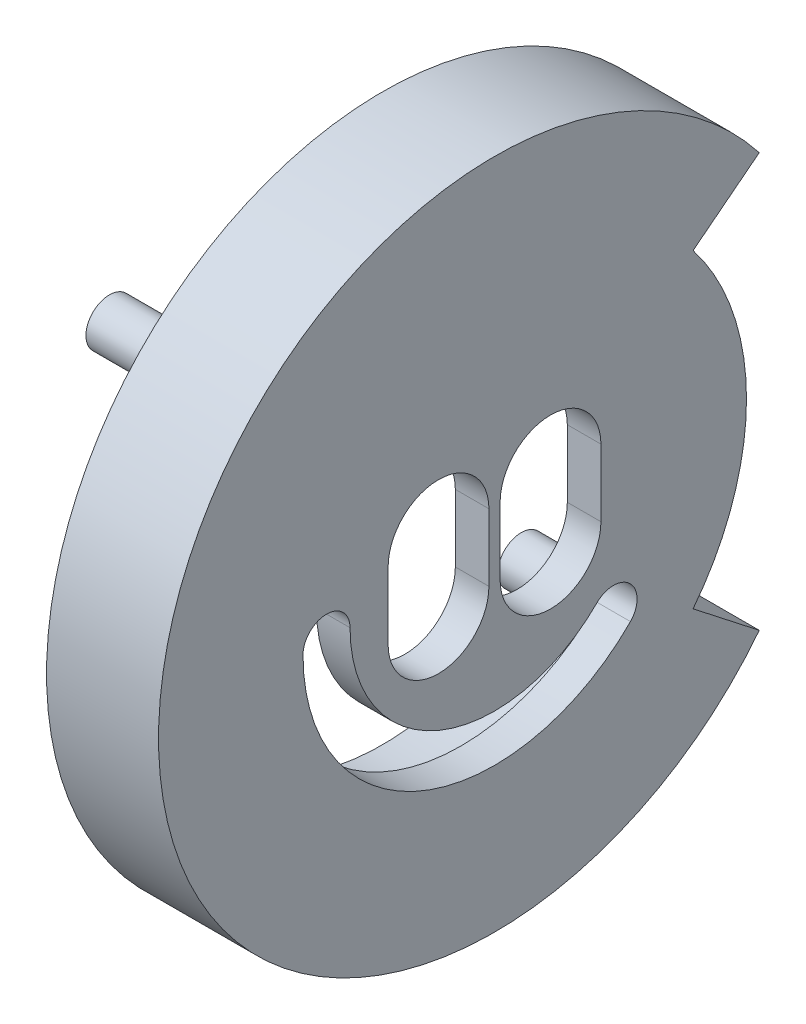
ISO-10303-21;
HEADER;
FILE_DESCRIPTION(('STEP AP214'),'2;1');
FILE_NAME('part.step','',(''),(''),'','','');
FILE_SCHEMA(('AUTOMOTIVE_DESIGN { 1 0 10303 214 1 1 1 1 }'));
ENDSEC;
DATA;
#1=APPLICATION_CONTEXT('core data for automotive mechanical design processes');
#2=APPLICATION_PROTOCOL_DEFINITION('international standard','automotive_design',2000,#1);
#3=PRODUCT_CONTEXT('',#1,'mechanical');
#4=PRODUCT('Part','Part','',(#3));
#5=PRODUCT_RELATED_PRODUCT_CATEGORY('part','',(#4));
#6=PRODUCT_DEFINITION_FORMATION('','',#4);
#7=PRODUCT_DEFINITION_CONTEXT('part definition',#1,'design');
#8=PRODUCT_DEFINITION('design','',#6,#7);
#9=PRODUCT_DEFINITION_SHAPE('','',#8);
#10=(LENGTH_UNIT() NAMED_UNIT(*) SI_UNIT(.MILLI.,.METRE.));
#11=(NAMED_UNIT(*) PLANE_ANGLE_UNIT() SI_UNIT($,.RADIAN.));
#12=(NAMED_UNIT(*) SI_UNIT($,.STERADIAN.) SOLID_ANGLE_UNIT());
#13=UNCERTAINTY_MEASURE_WITH_UNIT(LENGTH_MEASURE(1.E-05),#10,'distance_accuracy_value','');
#14=(GEOMETRIC_REPRESENTATION_CONTEXT(3) GLOBAL_UNCERTAINTY_ASSIGNED_CONTEXT((#13)) GLOBAL_UNIT_ASSIGNED_CONTEXT((#10,
#11,#12)) REPRESENTATION_CONTEXT('',''));
#15=CARTESIAN_POINT('',(0.,0.,0.));
#16=DIRECTION('',(0.,0.,1.));
#17=DIRECTION('',(1.,0.,0.));
#18=AXIS2_PLACEMENT_3D('',#15,#16,#17);
#19=CARTESIAN_POINT('',(0.,0.,0.));
#20=DIRECTION('',(1.,0.,0.));
#21=DIRECTION('',(0.,0.,1.));
#22=AXIS2_PLACEMENT_3D('',#19,#20,#21);
#23=CYLINDRICAL_SURFACE('',#22,30.);
#24=DIRECTION('',(1.,0.,0.));
#25=VECTOR('',#24,1.);
#26=CARTESIAN_POINT('',(0.,-18.4698442597698,-23.6403226082017));
#27=LINE('',#26,#25);
#28=CARTESIAN_POINT('',(-5.,-18.4698442597698,-23.6403226082017));
#29=VERTEX_POINT('',#28);
#30=CARTESIAN_POINT('',(5.,-18.4698442597698,-23.6403226082017));
#31=VERTEX_POINT('',#30);
#32=EDGE_CURVE('E256',#29,#31,#27,.T.);
#33=ORIENTED_EDGE('',*,*,#32,.T.);
#34=CARTESIAN_POINT('',(5.,0.,0.));
#35=DIRECTION('',(1.,0.,0.));
#36=DIRECTION('',(0.,1.,0.));
#37=AXIS2_PLACEMENT_3D('',#34,#35,#36);
#38=CIRCLE('',#37,30.);
#39=CARTESIAN_POINT('',(5.,18.4698442597697,-23.6403226082017));
#40=VERTEX_POINT('',#39);
#41=EDGE_CURVE('E313',#40,#31,#38,.T.);
#42=ORIENTED_EDGE('',*,*,#41,.F.);
#43=DIRECTION('',(-1.,0.,0.));
#44=VECTOR('',#43,1.);
#45=CARTESIAN_POINT('',(0.,18.4698442597697,-23.6403226082017));
#46=LINE('',#45,#44);
#47=CARTESIAN_POINT('',(-5.,18.4698442597697,-23.6403226082017));
#48=VERTEX_POINT('',#47);
#49=EDGE_CURVE('E228',#40,#48,#46,.T.);
#50=ORIENTED_EDGE('',*,*,#49,.T.);
#51=CARTESIAN_POINT('',(-5.,0.,0.));
#52=DIRECTION('',(-1.,0.,0.));
#53=DIRECTION('',(0.,1.,0.));
#54=AXIS2_PLACEMENT_3D('',#51,#52,#53);
#55=CIRCLE('',#54,30.);
#56=EDGE_CURVE('E307',#29,#48,#55,.T.);
#57=ORIENTED_EDGE('',*,*,#56,.F.);
#58=EDGE_LOOP('',(#33,#42,#50,#57));
#59=FACE_BOUND('',#58,.T.);
#60=ADVANCED_FACE('F17',(#59),#23,.T.);
#61=CARTESIAN_POINT('',(0.,0.,0.));
#62=DIRECTION('',(1.,0.,0.));
#63=DIRECTION('',(0.,-1.,0.));
#64=AXIS2_PLACEMENT_3D('',#61,#62,#63);
#65=CYLINDRICAL_SURFACE('',#64,20.5);
#66=CARTESIAN_POINT('',(2.,0.,0.));
#67=DIRECTION('',(1.,0.,0.));
#68=DIRECTION('',(0.,-1.,0.));
#69=AXIS2_PLACEMENT_3D('',#66,#67,#68);
#70=CIRCLE('',#69,20.5);
#71=CARTESIAN_POINT('',(2.,20.5,0.));
#72=VERTEX_POINT('',#71);
#73=EDGE_CURVE('E372',#72,#72,#70,.T.);
#74=ORIENTED_EDGE('',*,*,#73,.T.);
#75=DIRECTION('',(-1.,0.,0.));
#76=VECTOR('',#75,1.);
#77=CARTESIAN_POINT('',(0.,20.5,0.));
#78=LINE('',#77,#76);
#79=CARTESIAN_POINT('',(-5.,20.5,0.));
#80=VERTEX_POINT('',#79);
#81=EDGE_CURVE('E11',#72,#80,#78,.T.);
#82=ORIENTED_EDGE('',*,*,#81,.T.);
#83=CARTESIAN_POINT('',(-5.,0.,0.));
#84=DIRECTION('',(1.,0.,0.));
#85=DIRECTION('',(0.,-1.,0.));
#86=AXIS2_PLACEMENT_3D('',#83,#84,#85);
#87=CIRCLE('',#86,20.5);
#88=EDGE_CURVE('E28',#80,#80,#87,.T.);
#89=ORIENTED_EDGE('',*,*,#88,.F.);
#90=ORIENTED_EDGE('',*,*,#81,.F.);
#91=EDGE_LOOP('',(#74,#82,#89,#90));
#92=FACE_BOUND('',#91,.T.);
#93=ADVANCED_FACE('F475',(#92),#65,.F.);
#94=CARTESIAN_POINT('',(-5.,0.,0.));
#95=DIRECTION('',(1.,0.,0.));
#96=DIRECTION('',(0.,1.,0.));
#97=AXIS2_PLACEMENT_3D('',#94,#95,#96);
#98=PLANE('',#97);
#99=ORIENTED_EDGE('',*,*,#88,.T.);
#100=EDGE_LOOP('',(#99));
#101=FACE_BOUND('',#100,.T.);
#102=CARTESIAN_POINT('',(-5.,-18.3847763108503,18.3847763108502));
#103=DIRECTION('',(1.,0.,0.));
#104=DIRECTION('',(0.,0.,-1.));
#105=AXIS2_PLACEMENT_3D('',#102,#103,#104);
#106=CIRCLE('',#105,2.1);
#107=CARTESIAN_POINT('',(-5.,-18.3847763108503,20.4847763108503));
#108=VERTEX_POINT('',#107);
#109=EDGE_CURVE('E393',#108,#108,#106,.T.);
#110=ORIENTED_EDGE('',*,*,#109,.T.);
#111=EDGE_LOOP('',(#110));
#112=FACE_BOUND('',#111,.T.);
#113=CARTESIAN_POINT('',(-5.,18.3847763108502,18.3847763108503));
#114=DIRECTION('',(1.,0.,0.));
#115=DIRECTION('',(0.,0.,-1.));
#116=AXIS2_PLACEMENT_3D('',#113,#114,#115);
#117=CIRCLE('',#116,2.1);
#118=CARTESIAN_POINT('',(-5.,18.3847763108502,20.4847763108503));
#119=VERTEX_POINT('',#118);
#120=EDGE_CURVE('E21',#119,#119,#117,.T.);
#121=ORIENTED_EDGE('',*,*,#120,.T.);
#122=EDGE_LOOP('',(#121));
#123=FACE_BOUND('',#122,.T.);
#124=CARTESIAN_POINT('',(-5.,-18.3847763108502,-18.3847763108503));
#125=DIRECTION('',(1.,0.,0.));
#126=DIRECTION('',(0.,0.,-1.));
#127=AXIS2_PLACEMENT_3D('',#124,#125,#126);
#128=CIRCLE('',#127,2.1);
#129=CARTESIAN_POINT('',(-5.,-18.3847763108502,-16.2847763108503));
#130=VERTEX_POINT('',#129);
#131=EDGE_CURVE('E300',#130,#130,#128,.T.);
#132=ORIENTED_EDGE('',*,*,#131,.T.);
#133=EDGE_LOOP('',(#132));
#134=FACE_BOUND('',#133,.T.);
#135=CARTESIAN_POINT('',(-5.,18.3847763108503,-18.3847763108503));
#136=DIRECTION('',(1.,0.,0.));
#137=DIRECTION('',(0.,0.,-1.));
#138=AXIS2_PLACEMENT_3D('',#135,#136,#137);
#139=CIRCLE('',#138,2.1);
#140=CARTESIAN_POINT('',(-5.,18.3847763108503,-16.2847763108503));
#141=VERTEX_POINT('',#140);
#142=EDGE_CURVE('E295',#141,#141,#139,.T.);
#143=ORIENTED_EDGE('',*,*,#142,.T.);
#144=EDGE_LOOP('',(#143));
#145=FACE_BOUND('',#144,.T.);
#146=DIRECTION('',(0.,-0.615661475325658,-0.788010753606722));
#147=VECTOR('',#146,1.);
#148=CARTESIAN_POINT('',(-5.,-9.29598589079823,-11.8983193539121));
#149=LINE('',#148,#147);
#150=CARTESIAN_POINT('',(-5.,-13.8523831948273,-17.7302419561512));
#151=VERTEX_POINT('',#150);
#152=EDGE_CURVE('E260',#151,#29,#149,.T.);
#153=ORIENTED_EDGE('',*,*,#152,.T.);
#154=ORIENTED_EDGE('',*,*,#56,.T.);
#155=DIRECTION('',(0.,-0.615661475325658,0.788010753606722));
#156=VECTOR('',#155,1.);
#157=CARTESIAN_POINT('',(-5.,6.92619159741366,-8.86512097807562));
#158=LINE('',#157,#156);
#159=CARTESIAN_POINT('',(-5.,13.8523831948273,-17.7302419561512));
#160=VERTEX_POINT('',#159);
#161=EDGE_CURVE('E214',#48,#160,#158,.T.);
#162=ORIENTED_EDGE('',*,*,#161,.T.);
#163=CARTESIAN_POINT('',(-5.,0.,0.));
#164=DIRECTION('',(-1.,0.,0.));
#165=DIRECTION('',(0.,0.,1.));
#166=AXIS2_PLACEMENT_3D('',#163,#164,#165);
#167=CIRCLE('',#166,22.5);
#168=EDGE_CURVE('E220',#160,#151,#167,.T.);
#169=ORIENTED_EDGE('',*,*,#168,.T.);
#170=EDGE_LOOP('',(#153,#154,#162,#169));
#171=FACE_BOUND('',#170,.T.);
#172=ADVANCED_FACE('F481',(#101,#112,#123,#134,#145,#171),#98,.F.);
#173=CARTESIAN_POINT('',(2.,0.,0.));
#174=DIRECTION('',(-1.,0.,0.));
#175=DIRECTION('',(0.,0.,1.));
#176=AXIS2_PLACEMENT_3D('',#173,#174,#175);
#177=PLANE('',#176);
#178=CARTESIAN_POINT('',(2.,-3.,-5.));
#179=DIRECTION('',(1.,0.,0.));
#180=DIRECTION('',(0.,0.,-1.));
#181=AXIS2_PLACEMENT_3D('',#178,#179,#180);
#182=CIRCLE('',#181,4.5);
#183=CARTESIAN_POINT('',(2.,-3.,-0.5));
#184=VERTEX_POINT('',#183);
#185=CARTESIAN_POINT('',(2.,-3.,-9.5));
#186=VERTEX_POINT('',#185);
#187=EDGE_CURVE('E390',#184,#186,#182,.T.);
#188=ORIENTED_EDGE('',*,*,#187,.T.);
#189=DIRECTION('',(0.,1.,0.));
#190=VECTOR('',#189,1.);
#191=CARTESIAN_POINT('',(2.,3.,-9.5));
#192=LINE('',#191,#190);
#193=CARTESIAN_POINT('',(2.,3.,-9.5));
#194=VERTEX_POINT('',#193);
#195=EDGE_CURVE('E254',#186,#194,#192,.T.);
#196=ORIENTED_EDGE('',*,*,#195,.T.);
#197=CARTESIAN_POINT('',(2.,3.,-5.));
#198=DIRECTION('',(1.,0.,0.));
#199=DIRECTION('',(0.,0.,1.));
#200=AXIS2_PLACEMENT_3D('',#197,#198,#199);
#201=CIRCLE('',#200,4.5);
#202=CARTESIAN_POINT('',(2.,3.,-0.5));
#203=VERTEX_POINT('',#202);
#204=EDGE_CURVE('E255',#194,#203,#201,.T.);
#205=ORIENTED_EDGE('',*,*,#204,.T.);
#206=DIRECTION('',(0.,-1.,0.));
#207=VECTOR('',#206,1.);
#208=CARTESIAN_POINT('',(2.,-25.,-0.5));
#209=LINE('',#208,#207);
#210=EDGE_CURVE('E369',#203,#184,#209,.T.);
#211=ORIENTED_EDGE('',*,*,#210,.T.);
#212=EDGE_LOOP('',(#188,#196,#205,#211));
#213=FACE_BOUND('',#212,.T.);
#214=DIRECTION('',(0.,1.,0.));
#215=VECTOR('',#214,1.);
#216=CARTESIAN_POINT('',(2.,25.,0.499999999999983));
#217=LINE('',#216,#215);
#218=CARTESIAN_POINT('',(2.,-3.,0.5));
#219=VERTEX_POINT('',#218);
#220=CARTESIAN_POINT('',(2.,3.,0.5));
#221=VERTEX_POINT('',#220);
#222=EDGE_CURVE('E274',#219,#221,#217,.T.);
#223=ORIENTED_EDGE('',*,*,#222,.T.);
#224=CARTESIAN_POINT('',(2.,3.,5.));
#225=DIRECTION('',(1.,0.,0.));
#226=DIRECTION('',(0.,0.,1.));
#227=AXIS2_PLACEMENT_3D('',#224,#225,#226);
#228=CIRCLE('',#227,4.5);
#229=CARTESIAN_POINT('',(2.,3.,9.5));
#230=VERTEX_POINT('',#229);
#231=EDGE_CURVE('E261',#221,#230,#228,.T.);
#232=ORIENTED_EDGE('',*,*,#231,.T.);
#233=DIRECTION('',(0.,-1.,0.));
#234=VECTOR('',#233,1.);
#235=CARTESIAN_POINT('',(2.,-3.,9.5));
#236=LINE('',#235,#234);
#237=CARTESIAN_POINT('',(2.,-3.,9.5));
#238=VERTEX_POINT('',#237);
#239=EDGE_CURVE('E287',#230,#238,#236,.T.);
#240=ORIENTED_EDGE('',*,*,#239,.T.);
#241=CARTESIAN_POINT('',(2.,-3.,5.));
#242=DIRECTION('',(1.,0.,0.));
#243=DIRECTION('',(0.,0.,-1.));
#244=AXIS2_PLACEMENT_3D('',#241,#242,#243);
#245=CIRCLE('',#244,4.5);
#246=EDGE_CURVE('E346',#238,#219,#245,.T.);
#247=ORIENTED_EDGE('',*,*,#246,.T.);
#248=EDGE_LOOP('',(#223,#232,#240,#247));
#249=FACE_BOUND('',#248,.T.);
#250=CARTESIAN_POINT('',(2.,0.,15.));
#251=DIRECTION('',(1.,0.,0.));
#252=DIRECTION('',(0.,0.,-1.));
#253=AXIS2_PLACEMENT_3D('',#250,#251,#252);
#254=CIRCLE('',#253,2.1);
#255=CARTESIAN_POINT('',(2.,0.,12.9));
#256=VERTEX_POINT('',#255);
#257=CARTESIAN_POINT('',(2.,0.,17.1));
#258=VERTEX_POINT('',#257);
#259=EDGE_CURVE('E238',#256,#258,#254,.T.);
#260=ORIENTED_EDGE('',*,*,#259,.T.);
#261=CARTESIAN_POINT('',(2.,0.,0.));
#262=DIRECTION('',(1.,0.,0.));
#263=DIRECTION('',(0.,0.,-1.));
#264=AXIS2_PLACEMENT_3D('',#261,#262,#263);
#265=CIRCLE('',#264,17.1);
#266=CARTESIAN_POINT('',(2.,-12.0444371219939,-12.1384321233978));
#267=VERTEX_POINT('',#266);
#268=EDGE_CURVE('E280',#258,#267,#265,.T.);
#269=ORIENTED_EDGE('',*,*,#268,.T.);
#270=CARTESIAN_POINT('',(2.,-10.5859887010411,-10.6272147345554));
#271=DIRECTION('',(1.,0.,0.));
#272=DIRECTION('',(0.,-0.71685343909435,-0.697223885748762));
#273=AXIS2_PLACEMENT_3D('',#270,#271,#272);
#274=CIRCLE('',#273,2.10020232190131);
#275=CARTESIAN_POINT('',(2.,-9.08615432009881,-9.1570628299335));
#276=VERTEX_POINT('',#275);
#277=EDGE_CURVE('E279',#267,#276,#274,.T.);
#278=ORIENTED_EDGE('',*,*,#277,.T.);
#279=CARTESIAN_POINT('',(2.,0.,0.));
#280=DIRECTION('',(-1.,0.,0.));
#281=DIRECTION('',(0.,0.,1.));
#282=AXIS2_PLACEMENT_3D('',#279,#280,#281);
#283=CIRCLE('',#282,12.9);
#284=EDGE_CURVE('E248',#276,#256,#283,.T.);
#285=ORIENTED_EDGE('',*,*,#284,.T.);
#286=EDGE_LOOP('',(#260,#269,#278,#285));
#287=FACE_BOUND('',#286,.T.);
#288=ORIENTED_EDGE('',*,*,#73,.F.);
#289=EDGE_LOOP('',(#288));
#290=FACE_BOUND('',#289,.T.);
#291=ADVANCED_FACE('F447',(#213,#249,#287,#290),#177,.T.);
#292=CARTESIAN_POINT('',(5.,25.,-0.500000000000011));
#293=DIRECTION('',(0.,0.,-1.));
#294=DIRECTION('',(0.,-1.,0.));
#295=AXIS2_PLACEMENT_3D('',#292,#293,#294);
#296=PLANE('',#295);
#297=DIRECTION('',(1.,0.,0.));
#298=VECTOR('',#297,1.);
#299=CARTESIAN_POINT('',(5.,-3.,-0.500000000000007));
#300=LINE('',#299,#298);
#301=CARTESIAN_POINT('',(5.,-3.,-0.5));
#302=VERTEX_POINT('',#301);
#303=EDGE_CURVE('E388',#184,#302,#300,.T.);
#304=ORIENTED_EDGE('',*,*,#303,.F.);
#305=ORIENTED_EDGE('',*,*,#210,.F.);
#306=DIRECTION('',(1.,0.,0.));
#307=VECTOR('',#306,1.);
#308=CARTESIAN_POINT('',(5.,3.,-0.500000000000008));
#309=LINE('',#308,#307);
#310=CARTESIAN_POINT('',(5.,3.,-0.5));
#311=VERTEX_POINT('',#310);
#312=EDGE_CURVE('E387',#203,#311,#309,.T.);
#313=ORIENTED_EDGE('',*,*,#312,.T.);
#314=DIRECTION('',(0.,1.,0.));
#315=VECTOR('',#314,1.);
#316=CARTESIAN_POINT('',(5.,-25.,-0.5));
#317=LINE('',#316,#315);
#318=EDGE_CURVE('E308',#302,#311,#317,.T.);
#319=ORIENTED_EDGE('',*,*,#318,.F.);
#320=EDGE_LOOP('',(#304,#305,#313,#319));
#321=FACE_BOUND('',#320,.T.);
#322=ADVANCED_FACE('F453',(#321),#296,.T.);
#323=CARTESIAN_POINT('',(5.,-25.,0.5));
#324=DIRECTION('',(0.,0.,1.));
#325=DIRECTION('',(0.,-1.,0.));
#326=AXIS2_PLACEMENT_3D('',#323,#324,#325);
#327=PLANE('',#326);
#328=DIRECTION('',(1.,0.,0.));
#329=VECTOR('',#328,1.);
#330=CARTESIAN_POINT('',(5.,-3.,0.49999999999999));
#331=LINE('',#330,#329);
#332=CARTESIAN_POINT('',(5.,-3.,0.5));
#333=VERTEX_POINT('',#332);
#334=EDGE_CURVE('E365',#219,#333,#331,.T.);
#335=ORIENTED_EDGE('',*,*,#334,.T.);
#336=DIRECTION('',(0.,-1.,0.));
#337=VECTOR('',#336,1.);
#338=CARTESIAN_POINT('',(5.,25.,0.499999999999983));
#339=LINE('',#338,#337);
#340=CARTESIAN_POINT('',(5.,3.,0.5));
#341=VERTEX_POINT('',#340);
#342=EDGE_CURVE('E314',#341,#333,#339,.T.);
#343=ORIENTED_EDGE('',*,*,#342,.F.);
#344=DIRECTION('',(1.,0.,0.));
#345=VECTOR('',#344,1.);
#346=CARTESIAN_POINT('',(5.,3.,0.499999999999989));
#347=LINE('',#346,#345);
#348=EDGE_CURVE('E264',#221,#341,#347,.T.);
#349=ORIENTED_EDGE('',*,*,#348,.F.);
#350=ORIENTED_EDGE('',*,*,#222,.F.);
#351=EDGE_LOOP('',(#335,#343,#349,#350));
#352=FACE_BOUND('',#351,.T.);
#353=ADVANCED_FACE('F504',(#352),#327,.T.);
#354=CARTESIAN_POINT('',(5.,3.,5.));
#355=DIRECTION('',(-1.,0.,0.));
#356=DIRECTION('',(0.,0.,1.));
#357=AXIS2_PLACEMENT_3D('',#354,#355,#356);
#358=CYLINDRICAL_SURFACE('',#357,4.5);
#359=CARTESIAN_POINT('',(5.,3.,5.));
#360=DIRECTION('',(-1.,0.,0.));
#361=DIRECTION('',(0.,0.,1.));
#362=AXIS2_PLACEMENT_3D('',#359,#360,#361);
#363=CIRCLE('',#362,4.5);
#364=CARTESIAN_POINT('',(5.,3.,9.5));
#365=VERTEX_POINT('',#364);
#366=EDGE_CURVE('E318',#365,#341,#363,.T.);
#367=ORIENTED_EDGE('',*,*,#366,.F.);
#368=DIRECTION('',(-1.,0.,0.));
#369=VECTOR('',#368,1.);
#370=CARTESIAN_POINT('',(5.,3.,9.5));
#371=LINE('',#370,#369);
#372=EDGE_CURVE('E265',#365,#230,#371,.T.);
#373=ORIENTED_EDGE('',*,*,#372,.T.);
#374=ORIENTED_EDGE('',*,*,#231,.F.);
#375=ORIENTED_EDGE('',*,*,#348,.T.);
#376=EDGE_LOOP('',(#367,#373,#374,#375));
#377=FACE_BOUND('',#376,.T.);
#378=ADVANCED_FACE('F507',(#377),#358,.F.);
#379=CARTESIAN_POINT('',(5.,3.,9.5));
#380=DIRECTION('',(0.,0.,-1.));
#381=DIRECTION('',(0.,-1.,0.));
#382=AXIS2_PLACEMENT_3D('',#379,#380,#381);
#383=PLANE('',#382);
#384=DIRECTION('',(0.,1.,0.));
#385=VECTOR('',#384,1.);
#386=CARTESIAN_POINT('',(5.,-3.,9.5));
#387=LINE('',#386,#385);
#388=CARTESIAN_POINT('',(5.,-3.,9.5));
#389=VERTEX_POINT('',#388);
#390=EDGE_CURVE('E352',#389,#365,#387,.T.);
#391=ORIENTED_EDGE('',*,*,#390,.F.);
#392=DIRECTION('',(-1.,0.,0.));
#393=VECTOR('',#392,1.);
#394=CARTESIAN_POINT('',(5.,-3.,9.5));
#395=LINE('',#394,#393);
#396=EDGE_CURVE('E304',#389,#238,#395,.T.);
#397=ORIENTED_EDGE('',*,*,#396,.T.);
#398=ORIENTED_EDGE('',*,*,#239,.F.);
#399=ORIENTED_EDGE('',*,*,#372,.F.);
#400=EDGE_LOOP('',(#391,#397,#398,#399));
#401=FACE_BOUND('',#400,.T.);
#402=ADVANCED_FACE('F514',(#401),#383,.T.);
#403=CARTESIAN_POINT('',(5.,-3.,5.));
#404=DIRECTION('',(-1.,0.,0.));
#405=DIRECTION('',(0.,0.,-1.));
#406=AXIS2_PLACEMENT_3D('',#403,#404,#405);
#407=CYLINDRICAL_SURFACE('',#406,4.5);
#408=CARTESIAN_POINT('',(5.,-3.,5.));
#409=DIRECTION('',(-1.,0.,0.));
#410=DIRECTION('',(0.,0.,-1.));
#411=AXIS2_PLACEMENT_3D('',#408,#409,#410);
#412=CIRCLE('',#411,4.5);
#413=EDGE_CURVE('E348',#333,#389,#412,.T.);
#414=ORIENTED_EDGE('',*,*,#413,.F.);
#415=ORIENTED_EDGE('',*,*,#334,.F.);
#416=ORIENTED_EDGE('',*,*,#246,.F.);
#417=ORIENTED_EDGE('',*,*,#396,.F.);
#418=EDGE_LOOP('',(#414,#415,#416,#417));
#419=FACE_BOUND('',#418,.T.);
#420=ADVANCED_FACE('F511',(#419),#407,.F.);
#421=CARTESIAN_POINT('',(5.,-3.,-5.));
#422=DIRECTION('',(-1.,0.,0.));
#423=DIRECTION('',(0.,0.,-1.));
#424=AXIS2_PLACEMENT_3D('',#421,#422,#423);
#425=CYLINDRICAL_SURFACE('',#424,4.5);
#426=CARTESIAN_POINT('',(5.,-3.,-5.));
#427=DIRECTION('',(-1.,0.,0.));
#428=DIRECTION('',(0.,0.,-1.));
#429=AXIS2_PLACEMENT_3D('',#426,#427,#428);
#430=CIRCLE('',#429,4.5);
#431=CARTESIAN_POINT('',(5.,-3.,-9.5));
#432=VERTEX_POINT('',#431);
#433=EDGE_CURVE('E353',#432,#302,#430,.T.);
#434=ORIENTED_EDGE('',*,*,#433,.F.);
#435=DIRECTION('',(-1.,0.,0.));
#436=VECTOR('',#435,1.);
#437=CARTESIAN_POINT('',(5.,-3.,-9.5));
#438=LINE('',#437,#436);
#439=EDGE_CURVE('E356',#432,#186,#438,.T.);
#440=ORIENTED_EDGE('',*,*,#439,.T.);
#441=ORIENTED_EDGE('',*,*,#187,.F.);
#442=ORIENTED_EDGE('',*,*,#303,.T.);
#443=EDGE_LOOP('',(#434,#440,#441,#442));
#444=FACE_BOUND('',#443,.T.);
#445=ADVANCED_FACE('F440',(#444),#425,.F.);
#446=CARTESIAN_POINT('',(5.,-3.,-9.5));
#447=DIRECTION('',(0.,0.,1.));
#448=DIRECTION('',(1.,0.,0.));
#449=AXIS2_PLACEMENT_3D('',#446,#447,#448);
#450=PLANE('',#449);
#451=DIRECTION('',(0.,-1.,0.));
#452=VECTOR('',#451,1.);
#453=CARTESIAN_POINT('',(5.,3.,-9.5));
#454=LINE('',#453,#452);
#455=CARTESIAN_POINT('',(5.,3.,-9.5));
#456=VERTEX_POINT('',#455);
#457=EDGE_CURVE('E343',#456,#432,#454,.T.);
#458=ORIENTED_EDGE('',*,*,#457,.F.);
#459=DIRECTION('',(-1.,0.,0.));
#460=VECTOR('',#459,1.);
#461=CARTESIAN_POINT('',(5.,3.,-9.5));
#462=LINE('',#461,#460);
#463=EDGE_CURVE('E250',#456,#194,#462,.T.);
#464=ORIENTED_EDGE('',*,*,#463,.T.);
#465=ORIENTED_EDGE('',*,*,#195,.F.);
#466=ORIENTED_EDGE('',*,*,#439,.F.);
#467=EDGE_LOOP('',(#458,#464,#465,#466));
#468=FACE_BOUND('',#467,.T.);
#469=ADVANCED_FACE('F444',(#468),#450,.T.);
#470=CARTESIAN_POINT('',(5.,3.,-5.));
#471=DIRECTION('',(-1.,0.,0.));
#472=DIRECTION('',(0.,0.,1.));
#473=AXIS2_PLACEMENT_3D('',#470,#471,#472);
#474=CYLINDRICAL_SURFACE('',#473,4.5);
#475=CARTESIAN_POINT('',(5.,3.,-5.));
#476=DIRECTION('',(-1.,0.,0.));
#477=DIRECTION('',(0.,0.,1.));
#478=AXIS2_PLACEMENT_3D('',#475,#476,#477);
#479=CIRCLE('',#478,4.5);
#480=EDGE_CURVE('E312',#311,#456,#479,.T.);
#481=ORIENTED_EDGE('',*,*,#480,.F.);
#482=ORIENTED_EDGE('',*,*,#312,.F.);
#483=ORIENTED_EDGE('',*,*,#204,.F.);
#484=ORIENTED_EDGE('',*,*,#463,.F.);
#485=EDGE_LOOP('',(#481,#482,#483,#484));
#486=FACE_BOUND('',#485,.T.);
#487=ADVANCED_FACE('F461',(#486),#474,.F.);
#488=CARTESIAN_POINT('',(-11.,-18.3847763108503,18.3847763108503));
#489=DIRECTION('',(1.,0.,0.));
#490=DIRECTION('',(0.,1.,0.));
#491=AXIS2_PLACEMENT_3D('',#488,#489,#490);
#492=PLANE('',#491);
#493=CARTESIAN_POINT('',(-11.,-18.3847763108503,18.3847763108502));
#494=DIRECTION('',(-1.,0.,0.));
#495=DIRECTION('',(0.,0.,-1.));
#496=AXIS2_PLACEMENT_3D('',#493,#494,#495);
#497=CIRCLE('',#496,2.1);
#498=CARTESIAN_POINT('',(-11.,-18.3847763108503,20.4847763108503));
#499=VERTEX_POINT('',#498);
#500=EDGE_CURVE('E357',#499,#499,#497,.T.);
#501=ORIENTED_EDGE('',*,*,#500,.T.);
#502=EDGE_LOOP('',(#501));
#503=FACE_BOUND('',#502,.T.);
#504=ADVANCED_FACE('F19',(#503),#492,.F.);
#505=CARTESIAN_POINT('',(5.,-18.3847763108503,18.3847763108502));
#506=DIRECTION('',(-1.,0.,0.));
#507=DIRECTION('',(0.,0.,-1.));
#508=AXIS2_PLACEMENT_3D('',#505,#506,#507);
#509=CYLINDRICAL_SURFACE('',#508,2.1);
#510=ORIENTED_EDGE('',*,*,#500,.F.);
#511=DIRECTION('',(1.,0.,0.));
#512=VECTOR('',#511,1.);
#513=CARTESIAN_POINT('',(5.,-18.3847763108503,20.4847763108503));
#514=LINE('',#513,#512);
#515=EDGE_CURVE('E361',#499,#108,#514,.T.);
#516=ORIENTED_EDGE('',*,*,#515,.T.);
#517=ORIENTED_EDGE('',*,*,#109,.F.);
#518=ORIENTED_EDGE('',*,*,#515,.F.);
#519=EDGE_LOOP('',(#510,#516,#517,#518));
#520=FACE_BOUND('',#519,.T.);
#521=ADVANCED_FACE('F469',(#520),#509,.T.);
#522=CARTESIAN_POINT('',(-11.,18.3847763108502,18.3847763108503));
#523=DIRECTION('',(1.,0.,0.));
#524=DIRECTION('',(0.,1.,0.));
#525=AXIS2_PLACEMENT_3D('',#522,#523,#524);
#526=PLANE('',#525);
#527=CARTESIAN_POINT('',(-11.,18.3847763108502,18.3847763108503));
#528=DIRECTION('',(-1.,0.,0.));
#529=DIRECTION('',(0.,0.,-1.));
#530=AXIS2_PLACEMENT_3D('',#527,#528,#529);
#531=CIRCLE('',#530,2.1);
#532=CARTESIAN_POINT('',(-11.,18.3847763108502,20.4847763108503));
#533=VERTEX_POINT('',#532);
#534=EDGE_CURVE('E319',#533,#533,#531,.T.);
#535=ORIENTED_EDGE('',*,*,#534,.T.);
#536=EDGE_LOOP('',(#535));
#537=FACE_BOUND('',#536,.T.);
#538=ADVANCED_FACE('F489',(#537),#526,.F.);
#539=CARTESIAN_POINT('',(5.,18.3847763108502,18.3847763108503));
#540=DIRECTION('',(-1.,0.,0.));
#541=DIRECTION('',(0.,0.,-1.));
#542=AXIS2_PLACEMENT_3D('',#539,#540,#541);
#543=CYLINDRICAL_SURFACE('',#542,2.1);
#544=ORIENTED_EDGE('',*,*,#534,.F.);
#545=DIRECTION('',(1.,0.,0.));
#546=VECTOR('',#545,1.);
#547=CARTESIAN_POINT('',(5.,18.3847763108502,20.4847763108503));
#548=LINE('',#547,#546);
#549=EDGE_CURVE('E322',#533,#119,#548,.T.);
#550=ORIENTED_EDGE('',*,*,#549,.T.);
#551=ORIENTED_EDGE('',*,*,#120,.F.);
#552=ORIENTED_EDGE('',*,*,#549,.F.);
#553=EDGE_LOOP('',(#544,#550,#551,#552));
#554=FACE_BOUND('',#553,.T.);
#555=ADVANCED_FACE('F485',(#554),#543,.T.);
#556=CARTESIAN_POINT('',(-11.,-18.3847763108503,-18.3847763108503));
#557=DIRECTION('',(1.,0.,0.));
#558=DIRECTION('',(0.,1.,0.));
#559=AXIS2_PLACEMENT_3D('',#556,#557,#558);
#560=PLANE('',#559);
#561=CARTESIAN_POINT('',(-11.,-18.3847763108502,-18.3847763108503));
#562=DIRECTION('',(-1.,0.,0.));
#563=DIRECTION('',(0.,0.,-1.));
#564=AXIS2_PLACEMENT_3D('',#561,#562,#563);
#565=CIRCLE('',#564,2.1);
#566=CARTESIAN_POINT('',(-11.,-18.3847763108502,-16.2847763108503));
#567=VERTEX_POINT('',#566);
#568=EDGE_CURVE('E301',#567,#567,#565,.T.);
#569=ORIENTED_EDGE('',*,*,#568,.T.);
#570=EDGE_LOOP('',(#569));
#571=FACE_BOUND('',#570,.T.);
#572=ADVANCED_FACE('F488',(#571),#560,.F.);
#573=CARTESIAN_POINT('',(5.,-18.3847763108502,-18.3847763108503));
#574=DIRECTION('',(-1.,0.,0.));
#575=DIRECTION('',(0.,0.,-1.));
#576=AXIS2_PLACEMENT_3D('',#573,#574,#575);
#577=CYLINDRICAL_SURFACE('',#576,2.1);
#578=ORIENTED_EDGE('',*,*,#568,.F.);
#579=DIRECTION('',(1.,0.,0.));
#580=VECTOR('',#579,1.);
#581=CARTESIAN_POINT('',(5.,-18.3847763108502,-16.2847763108503));
#582=LINE('',#581,#580);
#583=EDGE_CURVE('E296',#567,#130,#582,.T.);
#584=ORIENTED_EDGE('',*,*,#583,.T.);
#585=ORIENTED_EDGE('',*,*,#131,.F.);
#586=ORIENTED_EDGE('',*,*,#583,.F.);
#587=EDGE_LOOP('',(#578,#584,#585,#586));
#588=FACE_BOUND('',#587,.T.);
#589=ADVANCED_FACE('F522',(#588),#577,.T.);
#590=CARTESIAN_POINT('',(-11.,18.3847763108503,-18.3847763108503));
#591=DIRECTION('',(1.,0.,0.));
#592=DIRECTION('',(0.,1.,0.));
#593=AXIS2_PLACEMENT_3D('',#590,#591,#592);
#594=PLANE('',#593);
#595=CARTESIAN_POINT('',(-11.,18.3847763108503,-18.3847763108503));
#596=DIRECTION('',(-1.,0.,0.));
#597=DIRECTION('',(0.,0.,-1.));
#598=AXIS2_PLACEMENT_3D('',#595,#596,#597);
#599=CIRCLE('',#598,2.1);
#600=CARTESIAN_POINT('',(-11.,18.3847763108503,-16.2847763108503));
#601=VERTEX_POINT('',#600);
#602=EDGE_CURVE('E283',#601,#601,#599,.T.);
#603=ORIENTED_EDGE('',*,*,#602,.T.);
#604=EDGE_LOOP('',(#603));
#605=FACE_BOUND('',#604,.T.);
#606=ADVANCED_FACE('F519',(#605),#594,.F.);
#607=CARTESIAN_POINT('',(5.,18.3847763108503,-18.3847763108503));
#608=DIRECTION('',(-1.,0.,0.));
#609=DIRECTION('',(0.,0.,-1.));
#610=AXIS2_PLACEMENT_3D('',#607,#608,#609);
#611=CYLINDRICAL_SURFACE('',#610,2.1);
#612=ORIENTED_EDGE('',*,*,#602,.F.);
#613=DIRECTION('',(1.,0.,0.));
#614=VECTOR('',#613,1.);
#615=CARTESIAN_POINT('',(5.,18.3847763108503,-16.2847763108503));
#616=LINE('',#615,#614);
#617=EDGE_CURVE('E291',#601,#141,#616,.T.);
#618=ORIENTED_EDGE('',*,*,#617,.T.);
#619=ORIENTED_EDGE('',*,*,#142,.F.);
#620=ORIENTED_EDGE('',*,*,#617,.F.);
#621=EDGE_LOOP('',(#612,#618,#619,#620));
#622=FACE_BOUND('',#621,.T.);
#623=ADVANCED_FACE('F521',(#622),#611,.T.);
#624=CARTESIAN_POINT('',(5.,0.,0.));
#625=DIRECTION('',(-1.,0.,0.));
#626=DIRECTION('',(0.,0.,-1.));
#627=AXIS2_PLACEMENT_3D('',#624,#625,#626);
#628=CYLINDRICAL_SURFACE('',#627,17.1);
#629=ORIENTED_EDGE('',*,*,#268,.F.);
#630=DIRECTION('',(-1.,0.,0.));
#631=VECTOR('',#630,1.);
#632=CARTESIAN_POINT('',(5.,0.,17.1));
#633=LINE('',#632,#631);
#634=CARTESIAN_POINT('',(5.,0.,17.1));
#635=VERTEX_POINT('',#634);
#636=EDGE_CURVE('E242',#635,#258,#633,.T.);
#637=ORIENTED_EDGE('',*,*,#636,.F.);
#638=CARTESIAN_POINT('',(5.,0.,0.));
#639=DIRECTION('',(-1.,0.,0.));
#640=DIRECTION('',(0.,0.,-1.));
#641=AXIS2_PLACEMENT_3D('',#638,#639,#640);
#642=CIRCLE('',#641,17.1);
#643=CARTESIAN_POINT('',(5.,-12.0444371219939,-12.1384321233978));
#644=VERTEX_POINT('',#643);
#645=EDGE_CURVE('E270',#644,#635,#642,.T.);
#646=ORIENTED_EDGE('',*,*,#645,.F.);
#647=DIRECTION('',(-1.,0.,0.));
#648=VECTOR('',#647,1.);
#649=CARTESIAN_POINT('',(5.,-12.0444371219939,-12.1384321233978));
#650=LINE('',#649,#648);
#651=EDGE_CURVE('E249',#644,#267,#650,.T.);
#652=ORIENTED_EDGE('',*,*,#651,.T.);
#653=EDGE_LOOP('',(#629,#637,#646,#652));
#654=FACE_BOUND('',#653,.T.);
#655=ADVANCED_FACE('F495',(#654),#628,.F.);
#656=CARTESIAN_POINT('',(5.,0.,15.));
#657=DIRECTION('',(-1.,0.,0.));
#658=DIRECTION('',(0.,0.,-1.));
#659=AXIS2_PLACEMENT_3D('',#656,#657,#658);
#660=CYLINDRICAL_SURFACE('',#659,2.1);
#661=ORIENTED_EDGE('',*,*,#259,.F.);
#662=DIRECTION('',(-1.,0.,0.));
#663=VECTOR('',#662,1.);
#664=CARTESIAN_POINT('',(5.,0.,12.9));
#665=LINE('',#664,#663);
#666=CARTESIAN_POINT('',(5.,0.,12.9));
#667=VERTEX_POINT('',#666);
#668=EDGE_CURVE('E243',#667,#256,#665,.T.);
#669=ORIENTED_EDGE('',*,*,#668,.F.);
#670=CARTESIAN_POINT('',(5.,0.,15.));
#671=DIRECTION('',(-1.,0.,0.));
#672=DIRECTION('',(0.,0.,-1.));
#673=AXIS2_PLACEMENT_3D('',#670,#671,#672);
#674=CIRCLE('',#673,2.1);
#675=EDGE_CURVE('E317',#635,#667,#674,.T.);
#676=ORIENTED_EDGE('',*,*,#675,.F.);
#677=ORIENTED_EDGE('',*,*,#636,.T.);
#678=EDGE_LOOP('',(#661,#669,#676,#677));
#679=FACE_BOUND('',#678,.T.);
#680=ADVANCED_FACE('F491',(#679),#660,.F.);
#681=CARTESIAN_POINT('',(5.,0.,0.));
#682=DIRECTION('',(-1.,0.,0.));
#683=DIRECTION('',(0.,0.,1.));
#684=AXIS2_PLACEMENT_3D('',#681,#682,#683);
#685=CYLINDRICAL_SURFACE('',#684,12.9);
#686=ORIENTED_EDGE('',*,*,#284,.F.);
#687=DIRECTION('',(-1.,0.,0.));
#688=VECTOR('',#687,1.);
#689=CARTESIAN_POINT('',(5.,-9.08615432009881,-9.1570628299335));
#690=LINE('',#689,#688);
#691=CARTESIAN_POINT('',(5.,-9.08615432009881,-9.1570628299335));
#692=VERTEX_POINT('',#691);
#693=EDGE_CURVE('E244',#692,#276,#690,.T.);
#694=ORIENTED_EDGE('',*,*,#693,.F.);
#695=CARTESIAN_POINT('',(5.,0.,0.));
#696=DIRECTION('',(1.,0.,0.));
#697=DIRECTION('',(0.,0.,1.));
#698=AXIS2_PLACEMENT_3D('',#695,#696,#697);
#699=CIRCLE('',#698,12.9);
#700=EDGE_CURVE('E271',#667,#692,#699,.T.);
#701=ORIENTED_EDGE('',*,*,#700,.F.);
#702=ORIENTED_EDGE('',*,*,#668,.T.);
#703=EDGE_LOOP('',(#686,#694,#701,#702));
#704=FACE_BOUND('',#703,.T.);
#705=ADVANCED_FACE('F494',(#704),#685,.T.);
#706=CARTESIAN_POINT('',(5.,-10.5859887010411,-10.6272147345554));
#707=DIRECTION('',(-1.,0.,0.));
#708=DIRECTION('',(0.,0.709849831777213,-0.704353048070257));
#709=AXIS2_PLACEMENT_3D('',#706,#707,#708);
#710=CYLINDRICAL_SURFACE('',#709,2.10020232190131);
#711=ORIENTED_EDGE('',*,*,#277,.F.);
#712=ORIENTED_EDGE('',*,*,#651,.F.);
#713=CARTESIAN_POINT('',(5.,-10.5859887010411,-10.6272147345554));
#714=DIRECTION('',(-1.,0.,0.));
#715=DIRECTION('',(0.,-0.71685343909435,-0.697223885748762));
#716=AXIS2_PLACEMENT_3D('',#713,#714,#715);
#717=CIRCLE('',#716,2.10020232190131);
#718=EDGE_CURVE('E266',#692,#644,#717,.T.);
#719=ORIENTED_EDGE('',*,*,#718,.F.);
#720=ORIENTED_EDGE('',*,*,#693,.T.);
#721=EDGE_LOOP('',(#711,#712,#719,#720));
#722=FACE_BOUND('',#721,.T.);
#723=ADVANCED_FACE('F500',(#722),#710,.F.);
#724=CARTESIAN_POINT('',(5.,0.,0.));
#725=DIRECTION('',(1.,0.,0.));
#726=DIRECTION('',(0.,1.,0.));
#727=AXIS2_PLACEMENT_3D('',#724,#725,#726);
#728=PLANE('',#727);
#729=ORIENTED_EDGE('',*,*,#675,.T.);
#730=ORIENTED_EDGE('',*,*,#700,.T.);
#731=ORIENTED_EDGE('',*,*,#718,.T.);
#732=ORIENTED_EDGE('',*,*,#645,.T.);
#733=EDGE_LOOP('',(#729,#730,#731,#732));
#734=FACE_BOUND('',#733,.T.);
#735=ORIENTED_EDGE('',*,*,#413,.T.);
#736=ORIENTED_EDGE('',*,*,#390,.T.);
#737=ORIENTED_EDGE('',*,*,#366,.T.);
#738=ORIENTED_EDGE('',*,*,#342,.T.);
#739=EDGE_LOOP('',(#735,#736,#737,#738));
#740=FACE_BOUND('',#739,.T.);
#741=ORIENTED_EDGE('',*,*,#318,.T.);
#742=ORIENTED_EDGE('',*,*,#480,.T.);
#743=ORIENTED_EDGE('',*,*,#457,.T.);
#744=ORIENTED_EDGE('',*,*,#433,.T.);
#745=EDGE_LOOP('',(#741,#742,#743,#744));
#746=FACE_BOUND('',#745,.T.);
#747=DIRECTION('',(0.,0.615661475325658,0.788010753606722));
#748=VECTOR('',#747,1.);
#749=CARTESIAN_POINT('',(5.,-9.29598589079823,-11.8983193539121));
#750=LINE('',#749,#748);
#751=CARTESIAN_POINT('',(5.,-13.8523831948273,-17.7302419561512));
#752=VERTEX_POINT('',#751);
#753=EDGE_CURVE('E208',#31,#752,#750,.T.);
#754=ORIENTED_EDGE('',*,*,#753,.T.);
#755=CARTESIAN_POINT('',(5.,0.,0.));
#756=DIRECTION('',(1.,0.,0.));
#757=DIRECTION('',(0.,0.,1.));
#758=AXIS2_PLACEMENT_3D('',#755,#756,#757);
#759=CIRCLE('',#758,22.5);
#760=CARTESIAN_POINT('',(5.,13.8523831948273,-17.7302419561512));
#761=VERTEX_POINT('',#760);
#762=EDGE_CURVE('E201',#752,#761,#759,.T.);
#763=ORIENTED_EDGE('',*,*,#762,.T.);
#764=DIRECTION('',(0.,0.615661475325658,-0.788010753606722));
#765=VECTOR('',#764,1.);
#766=CARTESIAN_POINT('',(5.,6.92619159741366,-8.86512097807562));
#767=LINE('',#766,#765);
#768=EDGE_CURVE('E205',#761,#40,#767,.T.);
#769=ORIENTED_EDGE('',*,*,#768,.T.);
#770=ORIENTED_EDGE('',*,*,#41,.T.);
#771=EDGE_LOOP('',(#754,#763,#769,#770));
#772=FACE_BOUND('',#771,.T.);
#773=ADVANCED_FACE('F203',(#734,#740,#746,#772),#728,.T.);
#774=CARTESIAN_POINT('',(5.,-18.5919717815965,-23.7966387078242));
#775=DIRECTION('',(0.,-0.788010753606722,0.615661475325658));
#776=DIRECTION('',(-1.,0.,0.));
#777=AXIS2_PLACEMENT_3D('',#774,#775,#776);
#778=PLANE('',#777);
#779=ORIENTED_EDGE('',*,*,#32,.F.);
#780=ORIENTED_EDGE('',*,*,#152,.F.);
#781=DIRECTION('',(-1.,0.,0.));
#782=VECTOR('',#781,1.);
#783=CARTESIAN_POINT('',(5.,-13.8523831948273,-17.7302419561512));
#784=LINE('',#783,#782);
#785=EDGE_CURVE('E213',#752,#151,#784,.T.);
#786=ORIENTED_EDGE('',*,*,#785,.F.);
#787=ORIENTED_EDGE('',*,*,#753,.F.);
#788=EDGE_LOOP('',(#779,#780,#786,#787));
#789=FACE_BOUND('',#788,.T.);
#790=ADVANCED_FACE('F499',(#789),#778,.F.);
#791=CARTESIAN_POINT('',(5.,0.,0.));
#792=DIRECTION('',(-1.,0.,0.));
#793=DIRECTION('',(0.,0.,-1.));
#794=AXIS2_PLACEMENT_3D('',#791,#792,#793);
#795=CYLINDRICAL_SURFACE('',#794,22.5);
#796=ORIENTED_EDGE('',*,*,#762,.F.);
#797=ORIENTED_EDGE('',*,*,#785,.T.);
#798=ORIENTED_EDGE('',*,*,#168,.F.);
#799=DIRECTION('',(-1.,0.,0.));
#800=VECTOR('',#799,1.);
#801=CARTESIAN_POINT('',(5.,13.8523831948273,-17.7302419561512));
#802=LINE('',#801,#800);
#803=EDGE_CURVE('E217',#761,#160,#802,.T.);
#804=ORIENTED_EDGE('',*,*,#803,.F.);
#805=EDGE_LOOP('',(#796,#797,#798,#804));
#806=FACE_BOUND('',#805,.T.);
#807=ADVANCED_FACE('F218',(#806),#795,.T.);
#808=CARTESIAN_POINT('',(5.,13.8523831948273,-17.7302419561512));
#809=DIRECTION('',(0.,0.788010753606722,0.615661475325658));
#810=DIRECTION('',(1.,0.,0.));
#811=AXIS2_PLACEMENT_3D('',#808,#809,#810);
#812=PLANE('',#811);
#813=ORIENTED_EDGE('',*,*,#49,.F.);
#814=ORIENTED_EDGE('',*,*,#768,.F.);
#815=ORIENTED_EDGE('',*,*,#803,.T.);
#816=ORIENTED_EDGE('',*,*,#161,.F.);
#817=EDGE_LOOP('',(#813,#814,#815,#816));
#818=FACE_BOUND('',#817,.T.);
#819=ADVANCED_FACE('F226',(#818),#812,.F.);
#820=CLOSED_SHELL('',(#60,#93,#172,#291,#322,#353,#378,#402,#420,#445,#469,#487,#504,#521,#538,
#555,#572,#589,#606,#623,#655,#680,#705,#723,#773,#790,#807,#819));
#821=MANIFOLD_SOLID_BREP('B1',#820);
#822=ADVANCED_BREP_SHAPE_REPRESENTATION('',(#18,#821),#14);
#823=SHAPE_DEFINITION_REPRESENTATION(#9,#822);
ENDSEC;
END-ISO-10303-21;
